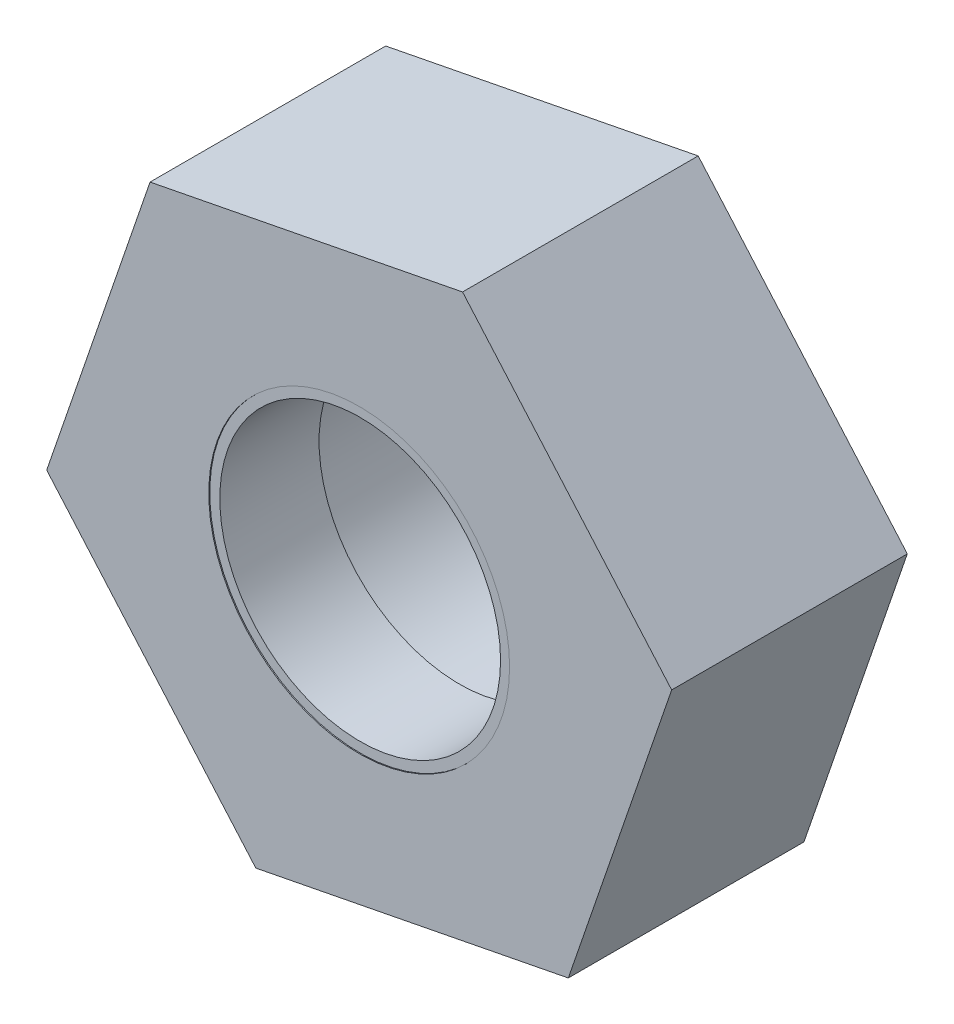
ISO-10303-21;
HEADER;
FILE_DESCRIPTION(('STEP AP214'),'2;1');
FILE_NAME('part.step','',(''),(''),'','','');
FILE_SCHEMA(('AUTOMOTIVE_DESIGN { 1 0 10303 214 1 1 1 1 }'));
ENDSEC;
DATA;
#1=APPLICATION_CONTEXT('core data for automotive mechanical design processes');
#2=APPLICATION_PROTOCOL_DEFINITION('international standard','automotive_design',2000,#1);
#3=PRODUCT_CONTEXT('',#1,'mechanical');
#4=PRODUCT('Part','Part','',(#3));
#5=PRODUCT_RELATED_PRODUCT_CATEGORY('part','',(#4));
#6=PRODUCT_DEFINITION_FORMATION('','',#4);
#7=PRODUCT_DEFINITION_CONTEXT('part definition',#1,'design');
#8=PRODUCT_DEFINITION('design','',#6,#7);
#9=PRODUCT_DEFINITION_SHAPE('','',#8);
#10=(LENGTH_UNIT() NAMED_UNIT(*) SI_UNIT(.MILLI.,.METRE.));
#11=(NAMED_UNIT(*) PLANE_ANGLE_UNIT() SI_UNIT($,.RADIAN.));
#12=(NAMED_UNIT(*) SI_UNIT($,.STERADIAN.) SOLID_ANGLE_UNIT());
#13=UNCERTAINTY_MEASURE_WITH_UNIT(LENGTH_MEASURE(1.E-05),#10,'distance_accuracy_value','');
#14=(GEOMETRIC_REPRESENTATION_CONTEXT(3) GLOBAL_UNCERTAINTY_ASSIGNED_CONTEXT((#13)) GLOBAL_UNIT_ASSIGNED_CONTEXT((#10,
#11,#12)) REPRESENTATION_CONTEXT('',''));
#15=CARTESIAN_POINT('',(0.,0.,0.));
#16=DIRECTION('',(0.,0.,1.));
#17=DIRECTION('',(1.,0.,0.));
#18=AXIS2_PLACEMENT_3D('',#15,#16,#17);
#19=CARTESIAN_POINT('',(0.,0.,1.35));
#20=DIRECTION('',(0.,0.,1.));
#21=DIRECTION('',(1.,0.,0.));
#22=AXIS2_PLACEMENT_3D('',#19,#20,#21);
#23=CYLINDRICAL_SURFACE('',#22,1.4);
#24=CARTESIAN_POINT('',(0.,0.,1.35));
#25=DIRECTION('',(0.,0.,1.));
#26=DIRECTION('',(1.,0.,0.));
#27=AXIS2_PLACEMENT_3D('',#24,#25,#26);
#28=CIRCLE('',#27,1.4);
#29=CARTESIAN_POINT('',(1.4,0.,1.35));
#30=VERTEX_POINT('',#29);
#31=EDGE_CURVE('E256',#30,#30,#28,.T.);
#32=ORIENTED_EDGE('',*,*,#31,.F.);
#33=EDGE_LOOP('',(#32));
#34=FACE_BOUND('',#33,.T.);
#35=CARTESIAN_POINT('',(0.,0.,2.34));
#36=DIRECTION('',(0.,0.,1.));
#37=DIRECTION('',(1.,0.,0.));
#38=AXIS2_PLACEMENT_3D('',#35,#36,#37);
#39=CIRCLE('',#38,1.4);
#40=CARTESIAN_POINT('',(1.4,0.,2.34));
#41=VERTEX_POINT('',#40);
#42=EDGE_CURVE('E252',#41,#41,#39,.T.);
#43=ORIENTED_EDGE('',*,*,#42,.T.);
#44=EDGE_LOOP('',(#43));
#45=FACE_BOUND('',#44,.T.);
#46=ADVANCED_FACE('F35',(#34,#45),#23,.F.);
#47=CARTESIAN_POINT('',(0.,0.,2.35));
#48=DIRECTION('',(0.,0.,-1.));
#49=DIRECTION('',(-1.,0.,0.));
#50=AXIS2_PLACEMENT_3D('',#47,#48,#49);
#51=CYLINDRICAL_SURFACE('',#50,1.5);
#52=CARTESIAN_POINT('',(0.,0.,0.));
#53=DIRECTION('',(0.,0.,1.));
#54=DIRECTION('',(1.,0.,0.));
#55=AXIS2_PLACEMENT_3D('',#52,#53,#54);
#56=CIRCLE('',#55,1.5);
#57=CARTESIAN_POINT('',(1.5,0.,0.));
#58=VERTEX_POINT('',#57);
#59=EDGE_CURVE('E124',#58,#58,#56,.T.);
#60=ORIENTED_EDGE('',*,*,#59,.F.);
#61=EDGE_LOOP('',(#60));
#62=FACE_BOUND('',#61,.T.);
#63=CARTESIAN_POINT('',(0.,0.,1.35));
#64=DIRECTION('',(0.,0.,1.));
#65=DIRECTION('',(1.,0.,0.));
#66=AXIS2_PLACEMENT_3D('',#63,#64,#65);
#67=CIRCLE('',#66,1.5);
#68=CARTESIAN_POINT('',(1.5,0.,1.35));
#69=VERTEX_POINT('',#68);
#70=EDGE_CURVE('E260',#69,#69,#67,.T.);
#71=ORIENTED_EDGE('',*,*,#70,.T.);
#72=EDGE_LOOP('',(#71));
#73=FACE_BOUND('',#72,.T.);
#74=ADVANCED_FACE('F159',(#62,#73),#51,.F.);
#75=CARTESIAN_POINT('',(2.08561363310045,-2.39448305626891,2.35));
#76=DIRECTION('',(0.,0.,1.));
#77=DIRECTION('',(1.,0.,0.));
#78=AXIS2_PLACEMENT_3D('',#75,#76,#77);
#79=PLANE('',#78);
#80=CARTESIAN_POINT('',(0.,0.,2.35));
#81=DIRECTION('',(0.,0.,1.));
#82=DIRECTION('',(1.,0.,0.));
#83=AXIS2_PLACEMENT_3D('',#80,#81,#82);
#84=CIRCLE('',#83,1.5);
#85=CARTESIAN_POINT('',(1.5,0.,2.35));
#86=VERTEX_POINT('',#85);
#87=EDGE_CURVE('E257',#86,#86,#84,.T.);
#88=ORIENTED_EDGE('',*,*,#87,.F.);
#89=EDGE_LOOP('',(#88));
#90=FACE_BOUND('',#89,.T.);
#91=DIRECTION('',(0.981439813299547,0.191770417089162,0.));
#92=VECTOR('',#91,1.);
#93=CARTESIAN_POINT('',(-1.03087633911006,-3.0034359168786,2.35));
#94=LINE('',#93,#92);
#95=CARTESIAN_POINT('',(-1.03087633911006,-3.0034359168786,2.35));
#96=VERTEX_POINT('',#95);
#97=CARTESIAN_POINT('',(2.08561363310045,-2.39448305626891,2.35));
#98=VERTEX_POINT('',#97);
#99=EDGE_CURVE('E131',#96,#98,#94,.T.);
#100=ORIENTED_EDGE('',*,*,#99,.T.);
#101=DIRECTION('',(0.324641853756222,0.945837019147445,0.));
#102=VECTOR('',#101,1.);
#103=CARTESIAN_POINT('',(2.08561363310045,-2.39448305626891,2.35));
#104=LINE('',#103,#102);
#105=CARTESIAN_POINT('',(3.1164899722105,0.608952860609688,2.35));
#106=VERTEX_POINT('',#105);
#107=EDGE_CURVE('E89',#98,#106,#104,.T.);
#108=ORIENTED_EDGE('',*,*,#107,.T.);
#109=DIRECTION('',(-0.656797959543325,0.754066602058283,0.));
#110=VECTOR('',#109,1.);
#111=CARTESIAN_POINT('',(3.1164899722105,0.608952860609688,2.35));
#112=LINE('',#111,#110);
#113=CARTESIAN_POINT('',(1.03087633911006,3.0034359168786,2.35));
#114=VERTEX_POINT('',#113);
#115=EDGE_CURVE('E102',#106,#114,#112,.T.);
#116=ORIENTED_EDGE('',*,*,#115,.T.);
#117=DIRECTION('',(-0.981439813299547,-0.191770417089162,0.));
#118=VECTOR('',#117,1.);
#119=CARTESIAN_POINT('',(1.03087633911006,3.0034359168786,2.35));
#120=LINE('',#119,#118);
#121=CARTESIAN_POINT('',(-2.08561363310044,2.39448305626891,2.35));
#122=VERTEX_POINT('',#121);
#123=EDGE_CURVE('E96',#114,#122,#120,.T.);
#124=ORIENTED_EDGE('',*,*,#123,.T.);
#125=DIRECTION('',(-0.324641853756222,-0.945837019147445,0.));
#126=VECTOR('',#125,1.);
#127=CARTESIAN_POINT('',(-2.08561363310044,2.39448305626891,2.35));
#128=LINE('',#127,#126);
#129=CARTESIAN_POINT('',(-3.1164899722105,-0.608952860609688,2.35));
#130=VERTEX_POINT('',#129);
#131=EDGE_CURVE('E100',#122,#130,#128,.T.);
#132=ORIENTED_EDGE('',*,*,#131,.T.);
#133=DIRECTION('',(0.656797959543325,-0.754066602058283,0.));
#134=VECTOR('',#133,1.);
#135=CARTESIAN_POINT('',(-3.1164899722105,-0.608952860609688,2.35));
#136=LINE('',#135,#134);
#137=EDGE_CURVE('E52',#130,#96,#136,.T.);
#138=ORIENTED_EDGE('',*,*,#137,.T.);
#139=EDGE_LOOP('',(#100,#108,#116,#124,#132,#138));
#140=FACE_BOUND('',#139,.T.);
#141=ADVANCED_FACE('F98',(#90,#140),#79,.T.);
#142=CARTESIAN_POINT('',(2.08561363310045,-2.39448305626891,0.));
#143=DIRECTION('',(0.,0.,1.));
#144=DIRECTION('',(1.,0.,0.));
#145=AXIS2_PLACEMENT_3D('',#142,#143,#144);
#146=PLANE('',#145);
#147=DIRECTION('',(0.981439813299547,0.191770417089162,0.));
#148=VECTOR('',#147,1.);
#149=CARTESIAN_POINT('',(-1.03087633911006,-3.0034359168786,0.));
#150=LINE('',#149,#148);
#151=CARTESIAN_POINT('',(-1.03087633911006,-3.0034359168786,0.));
#152=VERTEX_POINT('',#151);
#153=CARTESIAN_POINT('',(2.08561363310045,-2.39448305626891,0.));
#154=VERTEX_POINT('',#153);
#155=EDGE_CURVE('E120',#152,#154,#150,.T.);
#156=ORIENTED_EDGE('',*,*,#155,.F.);
#157=DIRECTION('',(0.656797959543325,-0.754066602058283,0.));
#158=VECTOR('',#157,1.);
#159=CARTESIAN_POINT('',(-3.1164899722105,-0.608952860609688,0.));
#160=LINE('',#159,#158);
#161=CARTESIAN_POINT('',(-3.1164899722105,-0.608952860609688,0.));
#162=VERTEX_POINT('',#161);
#163=EDGE_CURVE('E81',#162,#152,#160,.T.);
#164=ORIENTED_EDGE('',*,*,#163,.F.);
#165=DIRECTION('',(-0.324641853756222,-0.945837019147445,0.));
#166=VECTOR('',#165,1.);
#167=CARTESIAN_POINT('',(-2.08561363310044,2.39448305626891,0.));
#168=LINE('',#167,#166);
#169=CARTESIAN_POINT('',(-2.08561363310044,2.39448305626891,0.));
#170=VERTEX_POINT('',#169);
#171=EDGE_CURVE('E75',#170,#162,#168,.T.);
#172=ORIENTED_EDGE('',*,*,#171,.F.);
#173=DIRECTION('',(-0.981439813299547,-0.191770417089162,0.));
#174=VECTOR('',#173,1.);
#175=CARTESIAN_POINT('',(1.03087633911006,3.0034359168786,0.));
#176=LINE('',#175,#174);
#177=CARTESIAN_POINT('',(1.03087633911006,3.0034359168786,0.));
#178=VERTEX_POINT('',#177);
#179=EDGE_CURVE('E110',#178,#170,#176,.T.);
#180=ORIENTED_EDGE('',*,*,#179,.F.);
#181=DIRECTION('',(-0.656797959543325,0.754066602058283,0.));
#182=VECTOR('',#181,1.);
#183=CARTESIAN_POINT('',(3.1164899722105,0.608952860609688,0.));
#184=LINE('',#183,#182);
#185=CARTESIAN_POINT('',(3.1164899722105,0.608952860609688,0.));
#186=VERTEX_POINT('',#185);
#187=EDGE_CURVE('E126',#186,#178,#184,.T.);
#188=ORIENTED_EDGE('',*,*,#187,.F.);
#189=DIRECTION('',(0.324641853756222,0.945837019147445,0.));
#190=VECTOR('',#189,1.);
#191=CARTESIAN_POINT('',(2.08561363310045,-2.39448305626891,0.));
#192=LINE('',#191,#190);
#193=EDGE_CURVE('E123',#154,#186,#192,.T.);
#194=ORIENTED_EDGE('',*,*,#193,.F.);
#195=EDGE_LOOP('',(#156,#164,#172,#180,#188,#194));
#196=FACE_BOUND('',#195,.T.);
#197=ORIENTED_EDGE('',*,*,#59,.T.);
#198=EDGE_LOOP('',(#197));
#199=FACE_BOUND('',#198,.T.);
#200=ADVANCED_FACE('F140',(#196,#199),#146,.F.);
#201=CARTESIAN_POINT('',(-1.03087633911006,-3.0034359168786,2.35));
#202=DIRECTION('',(-0.191770417089162,0.981439813299547,0.));
#203=DIRECTION('',(-0.981439813299547,-0.191770417089162,0.));
#204=AXIS2_PLACEMENT_3D('',#201,#202,#203);
#205=PLANE('',#204);
#206=ORIENTED_EDGE('',*,*,#155,.T.);
#207=DIRECTION('',(0.,0.,-1.));
#208=VECTOR('',#207,1.);
#209=CARTESIAN_POINT('',(2.08561363310045,-2.39448305626891,2.35));
#210=LINE('',#209,#208);
#211=EDGE_CURVE('E11',#98,#154,#210,.T.);
#212=ORIENTED_EDGE('',*,*,#211,.F.);
#213=ORIENTED_EDGE('',*,*,#99,.F.);
#214=DIRECTION('',(0.,0.,-1.));
#215=VECTOR('',#214,1.);
#216=CARTESIAN_POINT('',(-1.03087633911006,-3.0034359168786,2.35));
#217=LINE('',#216,#215);
#218=EDGE_CURVE('E116',#96,#152,#217,.T.);
#219=ORIENTED_EDGE('',*,*,#218,.T.);
#220=EDGE_LOOP('',(#206,#212,#213,#219));
#221=FACE_BOUND('',#220,.T.);
#222=ADVANCED_FACE('F37',(#221),#205,.F.);
#223=CARTESIAN_POINT('',(2.08561363310045,-2.39448305626891,2.35));
#224=DIRECTION('',(-0.945837019147445,0.324641853756222,0.));
#225=DIRECTION('',(-0.324641853756222,-0.945837019147445,0.));
#226=AXIS2_PLACEMENT_3D('',#223,#224,#225);
#227=PLANE('',#226);
#228=ORIENTED_EDGE('',*,*,#193,.T.);
#229=DIRECTION('',(0.,0.,-1.));
#230=VECTOR('',#229,1.);
#231=CARTESIAN_POINT('',(3.1164899722105,0.608952860609688,2.35));
#232=LINE('',#231,#230);
#233=EDGE_CURVE('E44',#106,#186,#232,.T.);
#234=ORIENTED_EDGE('',*,*,#233,.F.);
#235=ORIENTED_EDGE('',*,*,#107,.F.);
#236=ORIENTED_EDGE('',*,*,#211,.T.);
#237=EDGE_LOOP('',(#228,#234,#235,#236));
#238=FACE_BOUND('',#237,.T.);
#239=ADVANCED_FACE('F178',(#238),#227,.F.);
#240=CARTESIAN_POINT('',(3.1164899722105,0.608952860609688,2.35));
#241=DIRECTION('',(-0.754066602058283,-0.656797959543325,0.));
#242=DIRECTION('',(0.656797959543325,-0.754066602058283,0.));
#243=AXIS2_PLACEMENT_3D('',#240,#241,#242);
#244=PLANE('',#243);
#245=ORIENTED_EDGE('',*,*,#187,.T.);
#246=DIRECTION('',(0.,0.,-1.));
#247=VECTOR('',#246,1.);
#248=CARTESIAN_POINT('',(1.03087633911006,3.0034359168786,2.35));
#249=LINE('',#248,#247);
#250=EDGE_CURVE('E111',#114,#178,#249,.T.);
#251=ORIENTED_EDGE('',*,*,#250,.F.);
#252=ORIENTED_EDGE('',*,*,#115,.F.);
#253=ORIENTED_EDGE('',*,*,#233,.T.);
#254=EDGE_LOOP('',(#245,#251,#252,#253));
#255=FACE_BOUND('',#254,.T.);
#256=ADVANCED_FACE('F137',(#255),#244,.F.);
#257=CARTESIAN_POINT('',(1.03087633911006,3.0034359168786,2.35));
#258=DIRECTION('',(0.191770417089162,-0.981439813299547,0.));
#259=DIRECTION('',(0.981439813299547,0.191770417089162,0.));
#260=AXIS2_PLACEMENT_3D('',#257,#258,#259);
#261=PLANE('',#260);
#262=ORIENTED_EDGE('',*,*,#179,.T.);
#263=DIRECTION('',(0.,0.,-1.));
#264=VECTOR('',#263,1.);
#265=CARTESIAN_POINT('',(-2.08561363310044,2.39448305626891,2.35));
#266=LINE('',#265,#264);
#267=EDGE_CURVE('E107',#122,#170,#266,.T.);
#268=ORIENTED_EDGE('',*,*,#267,.F.);
#269=ORIENTED_EDGE('',*,*,#123,.F.);
#270=ORIENTED_EDGE('',*,*,#250,.T.);
#271=EDGE_LOOP('',(#262,#268,#269,#270));
#272=FACE_BOUND('',#271,.T.);
#273=ADVANCED_FACE('F108',(#272),#261,.F.);
#274=CARTESIAN_POINT('',(-2.08561363310044,2.39448305626891,2.35));
#275=DIRECTION('',(0.945837019147445,-0.324641853756222,0.));
#276=DIRECTION('',(0.324641853756222,0.945837019147445,0.));
#277=AXIS2_PLACEMENT_3D('',#274,#275,#276);
#278=PLANE('',#277);
#279=ORIENTED_EDGE('',*,*,#171,.T.);
#280=DIRECTION('',(0.,0.,-1.));
#281=VECTOR('',#280,1.);
#282=CARTESIAN_POINT('',(-3.1164899722105,-0.608952860609688,2.35));
#283=LINE('',#282,#281);
#284=EDGE_CURVE('E112',#130,#162,#283,.T.);
#285=ORIENTED_EDGE('',*,*,#284,.F.);
#286=ORIENTED_EDGE('',*,*,#131,.F.);
#287=ORIENTED_EDGE('',*,*,#267,.T.);
#288=EDGE_LOOP('',(#279,#285,#286,#287));
#289=FACE_BOUND('',#288,.T.);
#290=ADVANCED_FACE('F114',(#289),#278,.F.);
#291=CARTESIAN_POINT('',(-3.1164899722105,-0.608952860609688,2.35));
#292=DIRECTION('',(0.754066602058283,0.656797959543325,0.));
#293=DIRECTION('',(-0.656797959543325,0.754066602058283,0.));
#294=AXIS2_PLACEMENT_3D('',#291,#292,#293);
#295=PLANE('',#294);
#296=ORIENTED_EDGE('',*,*,#163,.T.);
#297=ORIENTED_EDGE('',*,*,#218,.F.);
#298=ORIENTED_EDGE('',*,*,#137,.F.);
#299=ORIENTED_EDGE('',*,*,#284,.T.);
#300=EDGE_LOOP('',(#296,#297,#298,#299));
#301=FACE_BOUND('',#300,.T.);
#302=ADVANCED_FACE('F145',(#301),#295,.F.);
#303=CARTESIAN_POINT('',(0.,0.,1.35));
#304=DIRECTION('',(0.,0.,1.));
#305=DIRECTION('',(1.,0.,0.));
#306=AXIS2_PLACEMENT_3D('',#303,#304,#305);
#307=PLANE('',#306);
#308=ORIENTED_EDGE('',*,*,#31,.T.);
#309=EDGE_LOOP('',(#308));
#310=FACE_BOUND('',#309,.T.);
#311=ORIENTED_EDGE('',*,*,#70,.F.);
#312=EDGE_LOOP('',(#311));
#313=FACE_BOUND('',#312,.T.);
#314=ADVANCED_FACE('F147',(#310,#313),#307,.F.);
#315=CARTESIAN_POINT('',(0.,0.,2.34));
#316=DIRECTION('',(0.,0.,1.));
#317=DIRECTION('',(1.,0.,0.));
#318=AXIS2_PLACEMENT_3D('',#315,#316,#317);
#319=CYLINDRICAL_SURFACE('',#318,1.5);
#320=CARTESIAN_POINT('',(0.,0.,2.34));
#321=DIRECTION('',(0.,0.,1.));
#322=DIRECTION('',(1.,0.,0.));
#323=AXIS2_PLACEMENT_3D('',#320,#321,#322);
#324=CIRCLE('',#323,1.5);
#325=CARTESIAN_POINT('',(1.5,0.,2.34));
#326=VERTEX_POINT('',#325);
#327=EDGE_CURVE('E255',#326,#326,#324,.T.);
#328=CARTESIAN_POINT('',(1.5,0.,2.34));
#329=CARTESIAN_POINT('',(1.5,0.,2.34010416666667));
#330=CARTESIAN_POINT('',(1.5,0.,2.34020833333333));
#331=CARTESIAN_POINT('',(1.5,0.,2.34041666666667));
#332=CARTESIAN_POINT('',(1.5,0.,2.34052083333333));
#333=CARTESIAN_POINT('',(1.5,0.,2.34072916666667));
#334=CARTESIAN_POINT('',(1.5,0.,2.34083333333333));
#335=CARTESIAN_POINT('',(1.5,0.,2.34104166666667));
#336=CARTESIAN_POINT('',(1.5,0.,2.34114583333333));
#337=CARTESIAN_POINT('',(1.5,0.,2.34135416666667));
#338=CARTESIAN_POINT('',(1.5,0.,2.34145833333333));
#339=CARTESIAN_POINT('',(1.5,0.,2.34166666666667));
#340=CARTESIAN_POINT('',(1.5,0.,2.34177083333333));
#341=CARTESIAN_POINT('',(1.5,0.,2.34197916666667));
#342=CARTESIAN_POINT('',(1.5,0.,2.34208333333333));
#343=CARTESIAN_POINT('',(1.5,0.,2.34229166666667));
#344=CARTESIAN_POINT('',(1.5,0.,2.34239583333333));
#345=CARTESIAN_POINT('',(1.5,0.,2.34260416666667));
#346=CARTESIAN_POINT('',(1.5,0.,2.34270833333333));
#347=CARTESIAN_POINT('',(1.5,0.,2.34291666666667));
#348=CARTESIAN_POINT('',(1.5,0.,2.34302083333333));
#349=CARTESIAN_POINT('',(1.5,0.,2.34322916666667));
#350=CARTESIAN_POINT('',(1.5,0.,2.34333333333333));
#351=CARTESIAN_POINT('',(1.5,0.,2.34354166666667));
#352=CARTESIAN_POINT('',(1.5,0.,2.34364583333333));
#353=CARTESIAN_POINT('',(1.5,0.,2.34385416666667));
#354=CARTESIAN_POINT('',(1.5,0.,2.34395833333333));
#355=CARTESIAN_POINT('',(1.5,0.,2.34416666666667));
#356=CARTESIAN_POINT('',(1.5,0.,2.34427083333333));
#357=CARTESIAN_POINT('',(1.5,0.,2.34447916666667));
#358=CARTESIAN_POINT('',(1.5,0.,2.34458333333333));
#359=CARTESIAN_POINT('',(1.5,0.,2.34479166666667));
#360=CARTESIAN_POINT('',(1.5,0.,2.34489583333333));
#361=CARTESIAN_POINT('',(1.5,0.,2.34510416666667));
#362=CARTESIAN_POINT('',(1.5,0.,2.34520833333333));
#363=CARTESIAN_POINT('',(1.5,0.,2.34541666666667));
#364=CARTESIAN_POINT('',(1.5,0.,2.34552083333333));
#365=CARTESIAN_POINT('',(1.5,0.,2.34572916666667));
#366=CARTESIAN_POINT('',(1.5,0.,2.34583333333333));
#367=CARTESIAN_POINT('',(1.5,0.,2.34604166666667));
#368=CARTESIAN_POINT('',(1.5,0.,2.34614583333333));
#369=CARTESIAN_POINT('',(1.5,0.,2.34635416666667));
#370=CARTESIAN_POINT('',(1.5,0.,2.34645833333333));
#371=CARTESIAN_POINT('',(1.5,0.,2.34666666666667));
#372=CARTESIAN_POINT('',(1.5,0.,2.34677083333333));
#373=CARTESIAN_POINT('',(1.5,0.,2.34697916666667));
#374=CARTESIAN_POINT('',(1.5,0.,2.34708333333333));
#375=CARTESIAN_POINT('',(1.5,0.,2.34729166666667));
#376=CARTESIAN_POINT('',(1.5,0.,2.34739583333333));
#377=CARTESIAN_POINT('',(1.5,0.,2.34760416666667));
#378=CARTESIAN_POINT('',(1.5,0.,2.34770833333333));
#379=CARTESIAN_POINT('',(1.5,0.,2.34791666666667));
#380=CARTESIAN_POINT('',(1.5,0.,2.34802083333333));
#381=CARTESIAN_POINT('',(1.5,0.,2.34822916666667));
#382=CARTESIAN_POINT('',(1.5,0.,2.34833333333333));
#383=CARTESIAN_POINT('',(1.5,0.,2.34854166666667));
#384=CARTESIAN_POINT('',(1.5,0.,2.34864583333333));
#385=CARTESIAN_POINT('',(1.5,0.,2.34885416666667));
#386=CARTESIAN_POINT('',(1.5,0.,2.34895833333333));
#387=CARTESIAN_POINT('',(1.5,0.,2.34916666666667));
#388=CARTESIAN_POINT('',(1.5,0.,2.34927083333333));
#389=CARTESIAN_POINT('',(1.5,0.,2.34947916666667));
#390=CARTESIAN_POINT('',(1.5,0.,2.34958333333333));
#391=CARTESIAN_POINT('',(1.5,0.,2.34979166666667));
#392=CARTESIAN_POINT('',(1.5,0.,2.34989583333333));
#393=CARTESIAN_POINT('',(1.5,0.,2.35));
#394=B_SPLINE_CURVE_WITH_KNOTS('',3,(#328,#329,#330,#331,#332,#333,#334,#335,#336,#337,#338,
#339,#340,#341,#342,#343,#344,#345,#346,#347,#348,#349,#350,#351,#352,#353,#354,#355,#356,#357,
#358,#359,#360,#361,#362,#363,#364,#365,#366,#367,#368,#369,#370,#371,#372,#373,#374,#375,#376,
#377,#378,#379,#380,#381,#382,#383,#384,#385,#386,#387,#388,#389,#390,#391,#392,#393),
.UNSPECIFIED.,.F.,.F.,(4,2,2,2,2,2,2,2,2,2,2,2,2,2,2,2,2,2,2,2,2,2,2,2,2,2,2,2,2,2,2,2,4),(0.,
0.000312499999999879,0.000624999999999758,0.000937499999999637,0.00124999999999995,
0.00156249999999983,0.00187499999999971,0.00218749999999959,0.0024999999999999,
0.00281249999999978,0.00312499999999966,0.00343749999999997,0.00374999999999985,
0.00406249999999973,0.0043749999999996,0.00468749999999992,0.0049999999999998,
0.00531249999999968,0.00562499999999999,0.00593749999999987,0.00624999999999975,
0.00656249999999962,0.00687499999999994,0.00718749999999982,0.00749999999999969,
0.00781250000000001,0.00812499999999989,0.00843749999999976,0.00874999999999964,
0.00906249999999996,0.00937499999999983,0.00968749999999971,0.01),.UNSPECIFIED.);
#395=EDGE_CURVE('BSEAM153',#326,#86,#394,.T.);
#396=ORIENTED_EDGE('',*,*,#327,.F.);
#397=ORIENTED_EDGE('',*,*,#87,.T.);
#398=ORIENTED_EDGE('',*,*,#395,.T.);
#399=ORIENTED_EDGE('',*,*,#395,.F.);
#400=EDGE_LOOP('',(#396,#398,#397,#399));
#401=FACE_BOUND('',#400,.T.);
#402=ADVANCED_FACE('F153',(#401),#319,.F.);
#403=CARTESIAN_POINT('',(0.,0.,2.34));
#404=DIRECTION('',(0.,0.,1.));
#405=DIRECTION('',(1.,0.,0.));
#406=AXIS2_PLACEMENT_3D('',#403,#404,#405);
#407=PLANE('',#406);
#408=ORIENTED_EDGE('',*,*,#42,.F.);
#409=EDGE_LOOP('',(#408));
#410=FACE_BOUND('',#409,.T.);
#411=ORIENTED_EDGE('',*,*,#327,.T.);
#412=EDGE_LOOP('',(#411));
#413=FACE_BOUND('',#412,.T.);
#414=ADVANCED_FACE('F236',(#410,#413),#407,.T.);
#415=CLOSED_SHELL('',(#46,#74,#141,#200,#222,#239,#256,#273,#290,#302,#314,#402,#414));
#416=MANIFOLD_SOLID_BREP('B2',#415);
#417=ADVANCED_BREP_SHAPE_REPRESENTATION('',(#18,#416),#14);
#418=SHAPE_DEFINITION_REPRESENTATION(#9,#417);
ENDSEC;
END-ISO-10303-21;
